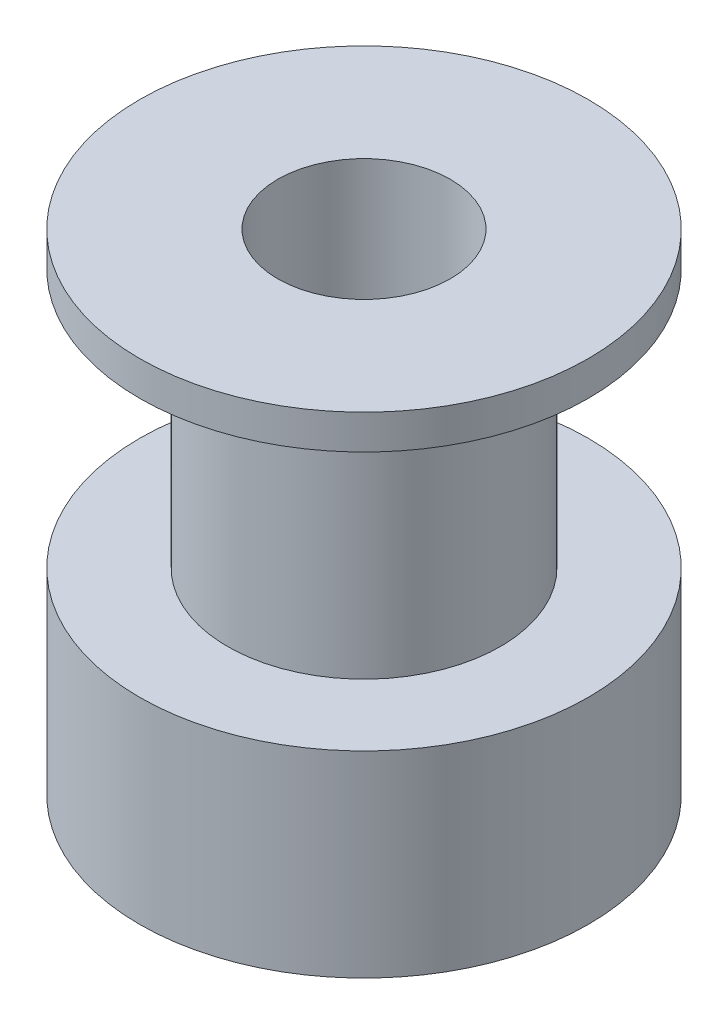
ISO-10303-21;
HEADER;
FILE_DESCRIPTION(('STEP AP214'),'2;1');
FILE_NAME('part.step','',(''),(''),'','','');
FILE_SCHEMA(('AUTOMOTIVE_DESIGN { 1 0 10303 214 1 1 1 1 }'));
ENDSEC;
DATA;
#1=APPLICATION_CONTEXT('core data for automotive mechanical design processes');
#2=APPLICATION_PROTOCOL_DEFINITION('international standard','automotive_design',2000,#1);
#3=PRODUCT_CONTEXT('',#1,'mechanical');
#4=PRODUCT('Part','Part','',(#3));
#5=PRODUCT_RELATED_PRODUCT_CATEGORY('part','',(#4));
#6=PRODUCT_DEFINITION_FORMATION('','',#4);
#7=PRODUCT_DEFINITION_CONTEXT('part definition',#1,'design');
#8=PRODUCT_DEFINITION('design','',#6,#7);
#9=PRODUCT_DEFINITION_SHAPE('','',#8);
#10=(LENGTH_UNIT() NAMED_UNIT(*) SI_UNIT(.MILLI.,.METRE.));
#11=(NAMED_UNIT(*) PLANE_ANGLE_UNIT() SI_UNIT($,.RADIAN.));
#12=(NAMED_UNIT(*) SI_UNIT($,.STERADIAN.) SOLID_ANGLE_UNIT());
#13=UNCERTAINTY_MEASURE_WITH_UNIT(LENGTH_MEASURE(1.E-05),#10,'distance_accuracy_value','');
#14=(GEOMETRIC_REPRESENTATION_CONTEXT(3) GLOBAL_UNCERTAINTY_ASSIGNED_CONTEXT((#13)) GLOBAL_UNIT_ASSIGNED_CONTEXT((#10,
#11,#12)) REPRESENTATION_CONTEXT('',''));
#15=CARTESIAN_POINT('',(0.,0.,0.));
#16=DIRECTION('',(0.,0.,1.));
#17=DIRECTION('',(1.,0.,0.));
#18=AXIS2_PLACEMENT_3D('',#15,#16,#17);
#19=CARTESIAN_POINT('',(0.,1.58319162761119,0.));
#20=DIRECTION('',(0.,1.,0.));
#21=DIRECTION('',(0.,0.,1.));
#22=AXIS2_PLACEMENT_3D('',#19,#20,#21);
#23=PLANE('',#22);
#24=CARTESIAN_POINT('',(0.,1.58319162761119,0.));
#25=DIRECTION('',(0.,1.,0.));
#26=DIRECTION('',(0.,0.,1.));
#27=AXIS2_PLACEMENT_3D('',#24,#25,#26);
#28=CIRCLE('',#27,2.5);
#29=CARTESIAN_POINT('',(0.,1.58319162761119,2.5));
#30=VERTEX_POINT('',#29);
#31=EDGE_CURVE('E58',#30,#30,#28,.T.);
#32=ORIENTED_EDGE('',*,*,#31,.T.);
#33=EDGE_LOOP('',(#32));
#34=FACE_BOUND('',#33,.T.);
#35=CARTESIAN_POINT('',(0.,1.58319162761119,0.));
#36=DIRECTION('',(0.,-1.,0.));
#37=DIRECTION('',(0.,0.,-1.));
#38=AXIS2_PLACEMENT_3D('',#35,#36,#37);
#39=CIRCLE('',#38,6.5);
#40=CARTESIAN_POINT('',(0.,1.58319162761119,-6.5));
#41=VERTEX_POINT('',#40);
#42=EDGE_CURVE('E55',#41,#41,#39,.T.);
#43=ORIENTED_EDGE('',*,*,#42,.T.);
#44=EDGE_LOOP('',(#43));
#45=FACE_BOUND('',#44,.T.);
#46=ADVANCED_FACE('F33',(#34,#45),#23,.F.);
#47=CARTESIAN_POINT('',(0.,15.7831916276112,0.));
#48=DIRECTION('',(0.,-1.,0.));
#49=DIRECTION('',(0.,0.,-1.));
#50=AXIS2_PLACEMENT_3D('',#47,#48,#49);
#51=PLANE('',#50);
#52=CARTESIAN_POINT('',(0.,15.7831916276112,0.));
#53=DIRECTION('',(0.,1.,0.));
#54=DIRECTION('',(0.,0.,1.));
#55=AXIS2_PLACEMENT_3D('',#52,#53,#54);
#56=CIRCLE('',#55,2.5);
#57=CARTESIAN_POINT('',(0.,15.7831916276112,2.5));
#58=VERTEX_POINT('',#57);
#59=EDGE_CURVE('E59',#58,#58,#56,.T.);
#60=ORIENTED_EDGE('',*,*,#59,.F.);
#61=EDGE_LOOP('',(#60));
#62=FACE_BOUND('',#61,.T.);
#63=CARTESIAN_POINT('',(0.,15.7831916276112,0.));
#64=DIRECTION('',(0.,-1.,0.));
#65=DIRECTION('',(0.,0.,-1.));
#66=AXIS2_PLACEMENT_3D('',#63,#64,#65);
#67=CIRCLE('',#66,6.5);
#68=CARTESIAN_POINT('',(0.,15.7831916276112,-6.5));
#69=VERTEX_POINT('',#68);
#70=EDGE_CURVE('E10',#69,#69,#67,.T.);
#71=ORIENTED_EDGE('',*,*,#70,.F.);
#72=EDGE_LOOP('',(#71));
#73=FACE_BOUND('',#72,.T.);
#74=ADVANCED_FACE('F74',(#62,#73),#51,.F.);
#75=CARTESIAN_POINT('',(0.,0.,0.));
#76=DIRECTION('',(0.,-1.,0.));
#77=DIRECTION('',(0.,0.,-1.));
#78=AXIS2_PLACEMENT_3D('',#75,#76,#77);
#79=CYLINDRICAL_SURFACE('',#78,6.5);
#80=CARTESIAN_POINT('',(0.,14.7831916276112,0.));
#81=DIRECTION('',(0.,-1.,0.));
#82=DIRECTION('',(0.,0.,-1.));
#83=AXIS2_PLACEMENT_3D('',#80,#81,#82);
#84=CIRCLE('',#83,6.5);
#85=CARTESIAN_POINT('',(0.,14.7831916276112,-6.5));
#86=VERTEX_POINT('',#85);
#87=EDGE_CURVE('E39',#86,#86,#84,.T.);
#88=ORIENTED_EDGE('',*,*,#87,.F.);
#89=EDGE_LOOP('',(#88));
#90=FACE_BOUND('',#89,.T.);
#91=ORIENTED_EDGE('',*,*,#70,.T.);
#92=EDGE_LOOP('',(#91));
#93=FACE_BOUND('',#92,.T.);
#94=ADVANCED_FACE('F77',(#90,#93),#79,.T.);
#95=CARTESIAN_POINT('',(0.,14.7831916276112,0.));
#96=DIRECTION('',(0.,1.,0.));
#97=DIRECTION('',(0.,0.,1.));
#98=AXIS2_PLACEMENT_3D('',#95,#96,#97);
#99=PLANE('',#98);
#100=CARTESIAN_POINT('',(0.,14.7831916276112,0.));
#101=DIRECTION('',(0.,-1.,0.));
#102=DIRECTION('',(0.,0.,-1.));
#103=AXIS2_PLACEMENT_3D('',#100,#101,#102);
#104=CIRCLE('',#103,3.95312651210374);
#105=CARTESIAN_POINT('',(0.,14.7831916276112,-3.95312651210374));
#106=VERTEX_POINT('',#105);
#107=EDGE_CURVE('E43',#106,#106,#104,.T.);
#108=ORIENTED_EDGE('',*,*,#107,.F.);
#109=EDGE_LOOP('',(#108));
#110=FACE_BOUND('',#109,.T.);
#111=ORIENTED_EDGE('',*,*,#87,.T.);
#112=EDGE_LOOP('',(#111));
#113=FACE_BOUND('',#112,.T.);
#114=ADVANCED_FACE('F82',(#110,#113),#99,.F.);
#115=CARTESIAN_POINT('',(0.,0.,0.));
#116=DIRECTION('',(0.,-1.,0.));
#117=DIRECTION('',(0.,0.,-1.));
#118=AXIS2_PLACEMENT_3D('',#115,#116,#117);
#119=CYLINDRICAL_SURFACE('',#118,3.95312651210374);
#120=CARTESIAN_POINT('',(0.,7.28319162761118,0.));
#121=DIRECTION('',(0.,-1.,0.));
#122=DIRECTION('',(0.,0.,-1.));
#123=AXIS2_PLACEMENT_3D('',#120,#121,#122);
#124=CIRCLE('',#123,3.95312651210374);
#125=CARTESIAN_POINT('',(0.,7.28319162761118,-3.95312651210374));
#126=VERTEX_POINT('',#125);
#127=EDGE_CURVE('E47',#126,#126,#124,.T.);
#128=ORIENTED_EDGE('',*,*,#127,.F.);
#129=EDGE_LOOP('',(#128));
#130=FACE_BOUND('',#129,.T.);
#131=ORIENTED_EDGE('',*,*,#107,.T.);
#132=EDGE_LOOP('',(#131));
#133=FACE_BOUND('',#132,.T.);
#134=ADVANCED_FACE('F88',(#130,#133),#119,.T.);
#135=CARTESIAN_POINT('',(0.,7.28319162761118,0.));
#136=DIRECTION('',(0.,-1.,0.));
#137=DIRECTION('',(0.,0.,-1.));
#138=AXIS2_PLACEMENT_3D('',#135,#136,#137);
#139=PLANE('',#138);
#140=CARTESIAN_POINT('',(0.,7.28319162761118,0.));
#141=DIRECTION('',(0.,-1.,0.));
#142=DIRECTION('',(0.,0.,-1.));
#143=AXIS2_PLACEMENT_3D('',#140,#141,#142);
#144=CIRCLE('',#143,6.5);
#145=CARTESIAN_POINT('',(0.,7.28319162761118,-6.5));
#146=VERTEX_POINT('',#145);
#147=EDGE_CURVE('E52',#146,#146,#144,.T.);
#148=ORIENTED_EDGE('',*,*,#147,.F.);
#149=EDGE_LOOP('',(#148));
#150=FACE_BOUND('',#149,.T.);
#151=ORIENTED_EDGE('',*,*,#127,.T.);
#152=EDGE_LOOP('',(#151));
#153=FACE_BOUND('',#152,.T.);
#154=ADVANCED_FACE('F92',(#150,#153),#139,.F.);
#155=CARTESIAN_POINT('',(0.,0.,0.));
#156=DIRECTION('',(0.,-1.,0.));
#157=DIRECTION('',(0.,0.,-1.));
#158=AXIS2_PLACEMENT_3D('',#155,#156,#157);
#159=CYLINDRICAL_SURFACE('',#158,6.5);
#160=ORIENTED_EDGE('',*,*,#42,.F.);
#161=EDGE_LOOP('',(#160));
#162=FACE_BOUND('',#161,.T.);
#163=ORIENTED_EDGE('',*,*,#147,.T.);
#164=EDGE_LOOP('',(#163));
#165=FACE_BOUND('',#164,.T.);
#166=ADVANCED_FACE('F70',(#162,#165),#159,.T.);
#167=CARTESIAN_POINT('',(0.,1.58319162761119,0.));
#168=DIRECTION('',(0.,1.,0.));
#169=DIRECTION('',(0.,0.,1.));
#170=AXIS2_PLACEMENT_3D('',#167,#168,#169);
#171=CYLINDRICAL_SURFACE('',#170,2.5);
#172=ORIENTED_EDGE('',*,*,#31,.F.);
#173=EDGE_LOOP('',(#172));
#174=FACE_BOUND('',#173,.T.);
#175=ORIENTED_EDGE('',*,*,#59,.T.);
#176=EDGE_LOOP('',(#175));
#177=FACE_BOUND('',#176,.T.);
#178=ADVANCED_FACE('F67',(#174,#177),#171,.F.);
#179=CLOSED_SHELL('',(#46,#74,#94,#114,#134,#154,#166,#178));
#180=MANIFOLD_SOLID_BREP('B2',#179);
#181=ADVANCED_BREP_SHAPE_REPRESENTATION('',(#18,#180),#14);
#182=SHAPE_DEFINITION_REPRESENTATION(#9,#181);
ENDSEC;
END-ISO-10303-21;
